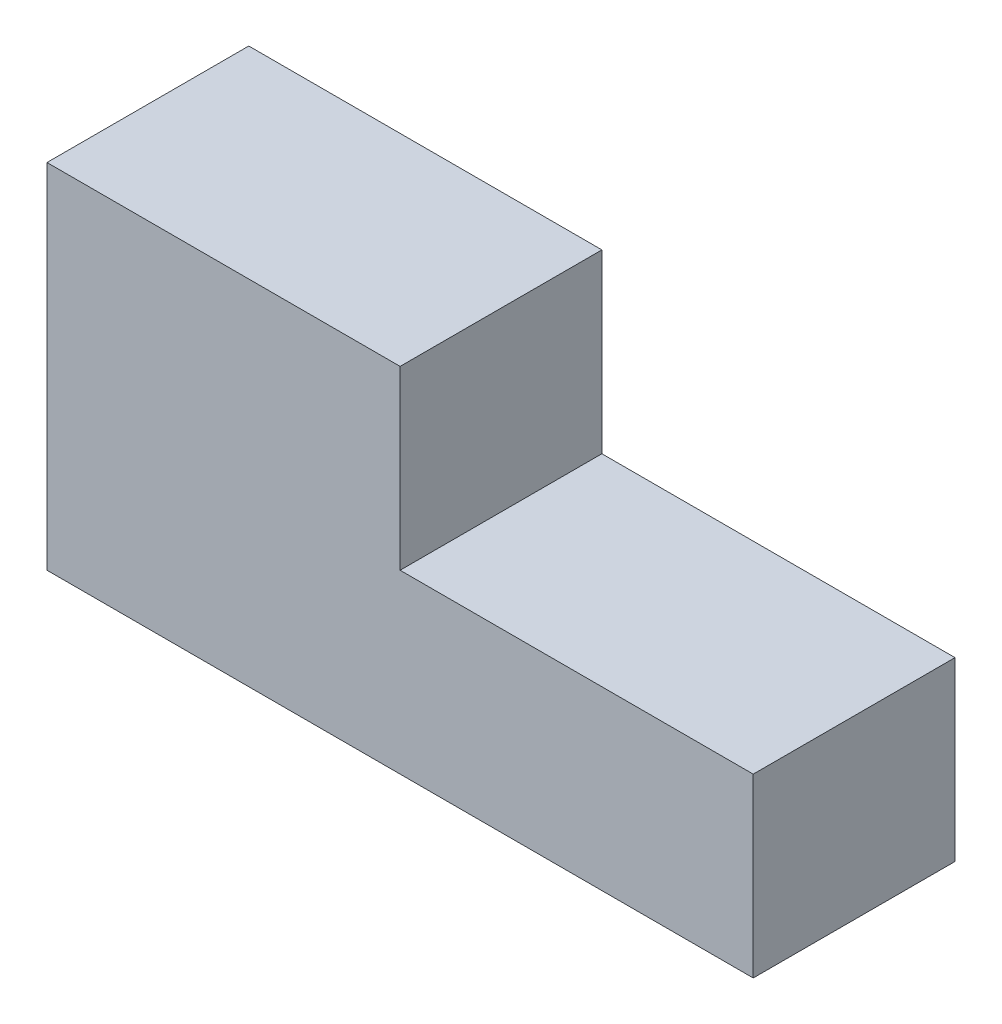
ISO-10303-21;
HEADER;
FILE_DESCRIPTION(('STEP AP214'),'2;1');
FILE_NAME('part.step','',(''),(''),'','','');
FILE_SCHEMA(('AUTOMOTIVE_DESIGN { 1 0 10303 214 1 1 1 1 }'));
ENDSEC;
DATA;
#1=APPLICATION_CONTEXT('core data for automotive mechanical design processes');
#2=APPLICATION_PROTOCOL_DEFINITION('international standard','automotive_design',2000,#1);
#3=PRODUCT_CONTEXT('',#1,'mechanical');
#4=PRODUCT('Part','Part','',(#3));
#5=PRODUCT_RELATED_PRODUCT_CATEGORY('part','',(#4));
#6=PRODUCT_DEFINITION_FORMATION('','',#4);
#7=PRODUCT_DEFINITION_CONTEXT('part definition',#1,'design');
#8=PRODUCT_DEFINITION('design','',#6,#7);
#9=PRODUCT_DEFINITION_SHAPE('','',#8);
#10=(LENGTH_UNIT() NAMED_UNIT(*) SI_UNIT(.MILLI.,.METRE.));
#11=(NAMED_UNIT(*) PLANE_ANGLE_UNIT() SI_UNIT($,.RADIAN.));
#12=(NAMED_UNIT(*) SI_UNIT($,.STERADIAN.) SOLID_ANGLE_UNIT());
#13=UNCERTAINTY_MEASURE_WITH_UNIT(LENGTH_MEASURE(1.E-05),#10,'distance_accuracy_value','');
#14=(GEOMETRIC_REPRESENTATION_CONTEXT(3) GLOBAL_UNCERTAINTY_ASSIGNED_CONTEXT((#13)) GLOBAL_UNIT_ASSIGNED_CONTEXT((#10,
#11,#12)) REPRESENTATION_CONTEXT('',''));
#15=CARTESIAN_POINT('',(0.,0.,0.));
#16=DIRECTION('',(0.,0.,1.));
#17=DIRECTION('',(1.,0.,0.));
#18=AXIS2_PLACEMENT_3D('',#15,#16,#17);
#19=CARTESIAN_POINT('',(-1.54312866675911,20.0143272147302,12.7));
#20=DIRECTION('',(0.,-1.,0.));
#21=DIRECTION('',(1.,0.,0.));
#22=AXIS2_PLACEMENT_3D('',#19,#20,#21);
#23=PLANE('',#22);
#24=DIRECTION('',(-1.,0.,0.));
#25=VECTOR('',#24,1.);
#26=CARTESIAN_POINT('',(-1.54312866675911,20.0143272147302,-12.7));
#27=LINE('',#26,#25);
#28=CARTESIAN_POINT('',(-1.54312866675911,20.0143272147302,-12.7));
#29=VERTEX_POINT('',#28);
#30=CARTESIAN_POINT('',(-45.9931286667591,20.0143272147302,-12.7));
#31=VERTEX_POINT('',#30);
#32=EDGE_CURVE('E117',#29,#31,#27,.T.);
#33=ORIENTED_EDGE('',*,*,#32,.T.);
#34=DIRECTION('',(0.,0.,-1.));
#35=VECTOR('',#34,1.);
#36=CARTESIAN_POINT('',(-45.9931286667591,20.0143272147302,12.7));
#37=LINE('',#36,#35);
#38=CARTESIAN_POINT('',(-45.9931286667591,20.0143272147302,12.7));
#39=VERTEX_POINT('',#38);
#40=EDGE_CURVE('E11',#39,#31,#37,.T.);
#41=ORIENTED_EDGE('',*,*,#40,.F.);
#42=DIRECTION('',(-1.,0.,0.));
#43=VECTOR('',#42,1.);
#44=CARTESIAN_POINT('',(-1.54312866675911,20.0143272147302,12.7));
#45=LINE('',#44,#43);
#46=CARTESIAN_POINT('',(-1.54312866675911,20.0143272147302,12.7));
#47=VERTEX_POINT('',#46);
#48=EDGE_CURVE('E127',#47,#39,#45,.T.);
#49=ORIENTED_EDGE('',*,*,#48,.F.);
#50=DIRECTION('',(0.,0.,-1.));
#51=VECTOR('',#50,1.);
#52=CARTESIAN_POINT('',(-1.54312866675911,20.0143272147302,12.7));
#53=LINE('',#52,#51);
#54=EDGE_CURVE('E113',#47,#29,#53,.T.);
#55=ORIENTED_EDGE('',*,*,#54,.T.);
#56=EDGE_LOOP('',(#33,#41,#49,#55));
#57=FACE_BOUND('',#56,.T.);
#58=ADVANCED_FACE('F33',(#57),#23,.F.);
#59=CARTESIAN_POINT('',(-45.9931286667591,20.0143272147302,12.7));
#60=DIRECTION('',(1.,0.,0.));
#61=DIRECTION('',(0.,1.,0.));
#62=AXIS2_PLACEMENT_3D('',#59,#60,#61);
#63=PLANE('',#62);
#64=DIRECTION('',(0.,-1.,0.));
#65=VECTOR('',#64,1.);
#66=CARTESIAN_POINT('',(-45.9931286667591,20.0143272147302,-12.7));
#67=LINE('',#66,#65);
#68=CARTESIAN_POINT('',(-45.9931286667591,-24.4356727852698,-12.7));
#69=VERTEX_POINT('',#68);
#70=EDGE_CURVE('E120',#31,#69,#67,.T.);
#71=ORIENTED_EDGE('',*,*,#70,.T.);
#72=DIRECTION('',(0.,0.,-1.));
#73=VECTOR('',#72,1.);
#74=CARTESIAN_POINT('',(-45.9931286667591,-24.4356727852698,12.7));
#75=LINE('',#74,#73);
#76=CARTESIAN_POINT('',(-45.9931286667591,-24.4356727852698,12.7));
#77=VERTEX_POINT('',#76);
#78=EDGE_CURVE('E41',#77,#69,#75,.T.);
#79=ORIENTED_EDGE('',*,*,#78,.F.);
#80=DIRECTION('',(0.,-1.,0.));
#81=VECTOR('',#80,1.);
#82=CARTESIAN_POINT('',(-45.9931286667591,20.0143272147302,12.7));
#83=LINE('',#82,#81);
#84=EDGE_CURVE('E86',#39,#77,#83,.T.);
#85=ORIENTED_EDGE('',*,*,#84,.F.);
#86=ORIENTED_EDGE('',*,*,#40,.T.);
#87=EDGE_LOOP('',(#71,#79,#85,#86));
#88=FACE_BOUND('',#87,.T.);
#89=ADVANCED_FACE('F151',(#88),#63,.F.);
#90=CARTESIAN_POINT('',(-45.9931286667591,-24.4356727852698,12.7));
#91=DIRECTION('',(0.,1.,0.));
#92=DIRECTION('',(-1.,0.,0.));
#93=AXIS2_PLACEMENT_3D('',#90,#91,#92);
#94=PLANE('',#93);
#95=DIRECTION('',(1.,0.,0.));
#96=VECTOR('',#95,1.);
#97=CARTESIAN_POINT('',(-45.9931286667591,-24.4356727852698,-12.7));
#98=LINE('',#97,#96);
#99=CARTESIAN_POINT('',(42.9068713332409,-24.4356727852698,-12.7));
#100=VERTEX_POINT('',#99);
#101=EDGE_CURVE('E122',#69,#100,#98,.T.);
#102=ORIENTED_EDGE('',*,*,#101,.T.);
#103=DIRECTION('',(0.,0.,-1.));
#104=VECTOR('',#103,1.);
#105=CARTESIAN_POINT('',(42.9068713332409,-24.4356727852698,12.7));
#106=LINE('',#105,#104);
#107=CARTESIAN_POINT('',(42.9068713332409,-24.4356727852698,12.7));
#108=VERTEX_POINT('',#107);
#109=EDGE_CURVE('E108',#108,#100,#106,.T.);
#110=ORIENTED_EDGE('',*,*,#109,.F.);
#111=DIRECTION('',(1.,0.,0.));
#112=VECTOR('',#111,1.);
#113=CARTESIAN_POINT('',(-45.9931286667591,-24.4356727852698,12.7));
#114=LINE('',#113,#112);
#115=EDGE_CURVE('E99',#77,#108,#114,.T.);
#116=ORIENTED_EDGE('',*,*,#115,.F.);
#117=ORIENTED_EDGE('',*,*,#78,.T.);
#118=EDGE_LOOP('',(#102,#110,#116,#117));
#119=FACE_BOUND('',#118,.T.);
#120=ADVANCED_FACE('F133',(#119),#94,.F.);
#121=CARTESIAN_POINT('',(42.9068713332409,-24.4356727852698,12.7));
#122=DIRECTION('',(-1.,0.,0.));
#123=DIRECTION('',(0.,0.,1.));
#124=AXIS2_PLACEMENT_3D('',#121,#122,#123);
#125=PLANE('',#124);
#126=DIRECTION('',(0.,1.,0.));
#127=VECTOR('',#126,1.);
#128=CARTESIAN_POINT('',(42.9068713332409,-24.4356727852698,-12.7));
#129=LINE('',#128,#127);
#130=CARTESIAN_POINT('',(42.9068713332409,-2.21067278526983,-12.7));
#131=VERTEX_POINT('',#130);
#132=EDGE_CURVE('E107',#100,#131,#129,.T.);
#133=ORIENTED_EDGE('',*,*,#132,.T.);
#134=DIRECTION('',(0.,0.,-1.));
#135=VECTOR('',#134,1.);
#136=CARTESIAN_POINT('',(42.9068713332409,-2.21067278526983,12.7));
#137=LINE('',#136,#135);
#138=CARTESIAN_POINT('',(42.9068713332409,-2.21067278526983,12.7));
#139=VERTEX_POINT('',#138);
#140=EDGE_CURVE('E104',#139,#131,#137,.T.);
#141=ORIENTED_EDGE('',*,*,#140,.F.);
#142=DIRECTION('',(0.,1.,0.));
#143=VECTOR('',#142,1.);
#144=CARTESIAN_POINT('',(42.9068713332409,-24.4356727852698,12.7));
#145=LINE('',#144,#143);
#146=EDGE_CURVE('E93',#108,#139,#145,.T.);
#147=ORIENTED_EDGE('',*,*,#146,.F.);
#148=ORIENTED_EDGE('',*,*,#109,.T.);
#149=EDGE_LOOP('',(#133,#141,#147,#148));
#150=FACE_BOUND('',#149,.T.);
#151=ADVANCED_FACE('F105',(#150),#125,.F.);
#152=CARTESIAN_POINT('',(42.9068713332409,-2.21067278526983,12.7));
#153=DIRECTION('',(0.,-1.,0.));
#154=DIRECTION('',(1.,0.,0.));
#155=AXIS2_PLACEMENT_3D('',#152,#153,#154);
#156=PLANE('',#155);
#157=DIRECTION('',(-1.,0.,0.));
#158=VECTOR('',#157,1.);
#159=CARTESIAN_POINT('',(42.9068713332409,-2.21067278526983,-12.7));
#160=LINE('',#159,#158);
#161=CARTESIAN_POINT('',(-1.54312866675911,-2.21067278526984,-12.7));
#162=VERTEX_POINT('',#161);
#163=EDGE_CURVE('E72',#131,#162,#160,.T.);
#164=ORIENTED_EDGE('',*,*,#163,.T.);
#165=DIRECTION('',(0.,0.,-1.));
#166=VECTOR('',#165,1.);
#167=CARTESIAN_POINT('',(-1.54312866675911,-2.21067278526984,12.7));
#168=LINE('',#167,#166);
#169=CARTESIAN_POINT('',(-1.54312866675911,-2.21067278526984,12.7));
#170=VERTEX_POINT('',#169);
#171=EDGE_CURVE('E109',#170,#162,#168,.T.);
#172=ORIENTED_EDGE('',*,*,#171,.F.);
#173=DIRECTION('',(-1.,0.,0.));
#174=VECTOR('',#173,1.);
#175=CARTESIAN_POINT('',(42.9068713332409,-2.21067278526983,12.7));
#176=LINE('',#175,#174);
#177=EDGE_CURVE('E97',#139,#170,#176,.T.);
#178=ORIENTED_EDGE('',*,*,#177,.F.);
#179=ORIENTED_EDGE('',*,*,#140,.T.);
#180=EDGE_LOOP('',(#164,#172,#178,#179));
#181=FACE_BOUND('',#180,.T.);
#182=ADVANCED_FACE('F111',(#181),#156,.F.);
#183=CARTESIAN_POINT('',(-1.54312866675911,-2.21067278526984,12.7));
#184=DIRECTION('',(-1.,0.,0.));
#185=DIRECTION('',(0.,-1.,0.));
#186=AXIS2_PLACEMENT_3D('',#183,#184,#185);
#187=PLANE('',#186);
#188=DIRECTION('',(0.,1.,0.));
#189=VECTOR('',#188,1.);
#190=CARTESIAN_POINT('',(-1.54312866675911,-2.21067278526984,-12.7));
#191=LINE('',#190,#189);
#192=EDGE_CURVE('E78',#162,#29,#191,.T.);
#193=ORIENTED_EDGE('',*,*,#192,.T.);
#194=ORIENTED_EDGE('',*,*,#54,.F.);
#195=DIRECTION('',(0.,1.,0.));
#196=VECTOR('',#195,1.);
#197=CARTESIAN_POINT('',(-1.54312866675911,-2.21067278526984,12.7));
#198=LINE('',#197,#196);
#199=EDGE_CURVE('E49',#170,#47,#198,.T.);
#200=ORIENTED_EDGE('',*,*,#199,.F.);
#201=ORIENTED_EDGE('',*,*,#171,.T.);
#202=EDGE_LOOP('',(#193,#194,#200,#201));
#203=FACE_BOUND('',#202,.T.);
#204=ADVANCED_FACE('F140',(#203),#187,.F.);
#205=CARTESIAN_POINT('',(0.,0.,12.7));
#206=DIRECTION('',(0.,0.,1.));
#207=DIRECTION('',(1.,0.,0.));
#208=AXIS2_PLACEMENT_3D('',#205,#206,#207);
#209=PLANE('',#208);
#210=ORIENTED_EDGE('',*,*,#48,.T.);
#211=ORIENTED_EDGE('',*,*,#84,.T.);
#212=ORIENTED_EDGE('',*,*,#115,.T.);
#213=ORIENTED_EDGE('',*,*,#146,.T.);
#214=ORIENTED_EDGE('',*,*,#177,.T.);
#215=ORIENTED_EDGE('',*,*,#199,.T.);
#216=EDGE_LOOP('',(#210,#211,#212,#213,#214,#215));
#217=FACE_BOUND('',#216,.T.);
#218=ADVANCED_FACE('F95',(#217),#209,.T.);
#219=CARTESIAN_POINT('',(0.,0.,-12.7));
#220=DIRECTION('',(0.,0.,1.));
#221=DIRECTION('',(1.,0.,0.));
#222=AXIS2_PLACEMENT_3D('',#219,#220,#221);
#223=PLANE('',#222);
#224=ORIENTED_EDGE('',*,*,#32,.F.);
#225=ORIENTED_EDGE('',*,*,#192,.F.);
#226=ORIENTED_EDGE('',*,*,#163,.F.);
#227=ORIENTED_EDGE('',*,*,#132,.F.);
#228=ORIENTED_EDGE('',*,*,#101,.F.);
#229=ORIENTED_EDGE('',*,*,#70,.F.);
#230=EDGE_LOOP('',(#224,#225,#226,#227,#228,#229));
#231=FACE_BOUND('',#230,.T.);
#232=ADVANCED_FACE('F136',(#231),#223,.F.);
#233=CLOSED_SHELL('',(#58,#89,#120,#151,#182,#204,#218,#232));
#234=MANIFOLD_SOLID_BREP('B2',#233);
#235=ADVANCED_BREP_SHAPE_REPRESENTATION('',(#18,#234),#14);
#236=SHAPE_DEFINITION_REPRESENTATION(#9,#235);
ENDSEC;
END-ISO-10303-21;
